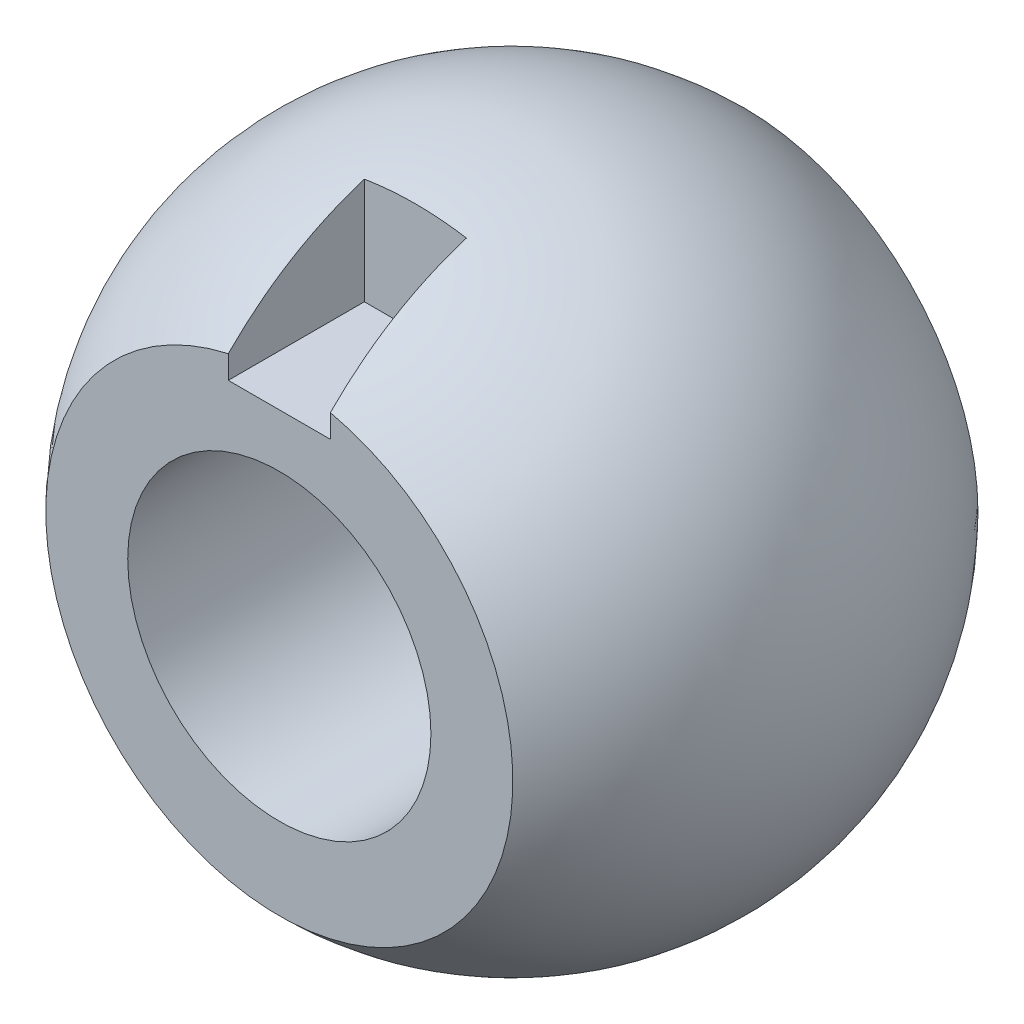
ISO-10303-21;
HEADER;
FILE_DESCRIPTION(('STEP AP214'),'2;1');
FILE_NAME('part.step','',(''),(''),'','','');
FILE_SCHEMA(('AUTOMOTIVE_DESIGN { 1 0 10303 214 1 1 1 1 }'));
ENDSEC;
DATA;
#1=APPLICATION_CONTEXT('core data for automotive mechanical design processes');
#2=APPLICATION_PROTOCOL_DEFINITION('international standard','automotive_design',2000,#1);
#3=PRODUCT_CONTEXT('',#1,'mechanical');
#4=PRODUCT('Part','Part','',(#3));
#5=PRODUCT_RELATED_PRODUCT_CATEGORY('part','',(#4));
#6=PRODUCT_DEFINITION_FORMATION('','',#4);
#7=PRODUCT_DEFINITION_CONTEXT('part definition',#1,'design');
#8=PRODUCT_DEFINITION('design','',#6,#7);
#9=PRODUCT_DEFINITION_SHAPE('','',#8);
#10=(LENGTH_UNIT() NAMED_UNIT(*) SI_UNIT(.MILLI.,.METRE.));
#11=(NAMED_UNIT(*) PLANE_ANGLE_UNIT() SI_UNIT($,.RADIAN.));
#12=(NAMED_UNIT(*) SI_UNIT($,.STERADIAN.) SOLID_ANGLE_UNIT());
#13=UNCERTAINTY_MEASURE_WITH_UNIT(LENGTH_MEASURE(1.E-05),#10,'distance_accuracy_value','');
#14=(GEOMETRIC_REPRESENTATION_CONTEXT(3) GLOBAL_UNCERTAINTY_ASSIGNED_CONTEXT((#13)) GLOBAL_UNIT_ASSIGNED_CONTEXT((#10,
#11,#12)) REPRESENTATION_CONTEXT('',''));
#15=CARTESIAN_POINT('',(0.,0.,0.));
#16=DIRECTION('',(0.,0.,1.));
#17=DIRECTION('',(1.,0.,0.));
#18=AXIS2_PLACEMENT_3D('',#15,#16,#17);
#19=CARTESIAN_POINT('',(0.,0.,0.));
#20=DIRECTION('',(0.,1.,0.));
#21=DIRECTION('',(1.,0.,0.));
#22=AXIS2_PLACEMENT_3D('',#19,#20,#21);
#23=SPHERICAL_SURFACE('',#22,7.874);
#24=CARTESIAN_POINT('',(-1.2192,0.,0.));
#25=DIRECTION('',(-1.,0.,0.));
#26=DIRECTION('',(0.,0.,1.));
#27=AXIS2_PLACEMENT_3D('',#24,#25,#26);
#28=CIRCLE('',#27,7.77903768855763);
#29=CARTESIAN_POINT('',(-1.2192,7.42968181401465,2.30505));
#30=VERTEX_POINT('',#29);
#31=CARTESIAN_POINT('',(-1.2192,5.44440201468444,5.55625));
#32=VERTEX_POINT('',#31);
#33=EDGE_CURVE('E97',#30,#32,#28,.F.);
#34=ORIENTED_EDGE('',*,*,#33,.F.);
#35=CARTESIAN_POINT('',(0.,0.,2.30505));
#36=DIRECTION('',(0.,0.,-1.));
#37=DIRECTION('',(-1.,0.,0.));
#38=AXIS2_PLACEMENT_3D('',#35,#36,#37);
#39=CIRCLE('',#38,7.52905176615887);
#40=CARTESIAN_POINT('',(1.2192,7.42968181401465,2.30505));
#41=VERTEX_POINT('',#40);
#42=EDGE_CURVE('E11',#41,#30,#39,.F.);
#43=ORIENTED_EDGE('',*,*,#42,.F.);
#44=CARTESIAN_POINT('',(1.2192,0.,0.));
#45=DIRECTION('',(1.,0.,0.));
#46=DIRECTION('',(0.,0.,-1.));
#47=AXIS2_PLACEMENT_3D('',#44,#45,#46);
#48=CIRCLE('',#47,7.77903768855763);
#49=CARTESIAN_POINT('',(1.2192,5.44440201468444,5.55625));
#50=VERTEX_POINT('',#49);
#51=EDGE_CURVE('E89',#50,#41,#48,.F.);
#52=ORIENTED_EDGE('',*,*,#51,.F.);
#53=CARTESIAN_POINT('',(0.,0.,5.55625));
#54=DIRECTION('',(0.,0.,1.));
#55=DIRECTION('',(1.,0.,0.));
#56=AXIS2_PLACEMENT_3D('',#53,#54,#55);
#57=CIRCLE('',#56,5.57924384997645);
#58=EDGE_CURVE('E104',#50,#32,#57,.F.);
#59=ORIENTED_EDGE('',*,*,#58,.T.);
#60=EDGE_LOOP('',(#34,#43,#52,#59));
#61=FACE_BOUND('',#60,.T.);
#62=CARTESIAN_POINT('',(0.,0.,-5.55625));
#63=DIRECTION('',(0.,0.,1.));
#64=DIRECTION('',(1.,0.,0.));
#65=AXIS2_PLACEMENT_3D('',#62,#63,#64);
#66=CIRCLE('',#65,5.57924384997645);
#67=CARTESIAN_POINT('',(5.57924384997645,0.,-5.55625));
#68=VERTEX_POINT('',#67);
#69=EDGE_CURVE('E100',#68,#68,#66,.F.);
#70=ORIENTED_EDGE('',*,*,#69,.F.);
#71=EDGE_LOOP('',(#70));
#72=FACE_BOUND('',#71,.T.);
#73=ADVANCED_FACE('F34',(#61,#72),#23,.T.);
#74=CARTESIAN_POINT('',(0.,0.,7.874));
#75=DIRECTION('',(0.,0.,-1.));
#76=DIRECTION('',(-1.,0.,0.));
#77=AXIS2_PLACEMENT_3D('',#74,#75,#76);
#78=CYLINDRICAL_SURFACE('',#77,3.62204);
#79=CARTESIAN_POINT('',(0.,0.,-5.55625));
#80=DIRECTION('',(0.,0.,1.));
#81=DIRECTION('',(1.,0.,0.));
#82=AXIS2_PLACEMENT_3D('',#79,#80,#81);
#83=CIRCLE('',#82,3.62204);
#84=CARTESIAN_POINT('',(3.62204,0.,-5.55625));
#85=VERTEX_POINT('',#84);
#86=EDGE_CURVE('E99',#85,#85,#83,.T.);
#87=ORIENTED_EDGE('',*,*,#86,.F.);
#88=EDGE_LOOP('',(#87));
#89=FACE_BOUND('',#88,.T.);
#90=CARTESIAN_POINT('',(0.,0.,5.55625));
#91=DIRECTION('',(0.,0.,1.));
#92=DIRECTION('',(1.,0.,0.));
#93=AXIS2_PLACEMENT_3D('',#90,#91,#92);
#94=CIRCLE('',#93,3.62204);
#95=CARTESIAN_POINT('',(3.62204,0.,5.55625));
#96=VERTEX_POINT('',#95);
#97=EDGE_CURVE('E103',#96,#96,#94,.T.);
#98=ORIENTED_EDGE('',*,*,#97,.T.);
#99=EDGE_LOOP('',(#98));
#100=FACE_BOUND('',#99,.T.);
#101=ADVANCED_FACE('F121',(#89,#100),#78,.F.);
#102=CARTESIAN_POINT('',(0.,0.,5.55625));
#103=DIRECTION('',(0.,0.,1.));
#104=DIRECTION('',(1.,0.,0.));
#105=AXIS2_PLACEMENT_3D('',#102,#103,#104);
#106=PLANE('',#105);
#107=DIRECTION('',(0.,-1.,0.));
#108=VECTOR('',#107,1.);
#109=CARTESIAN_POINT('',(-1.2192,0.,5.55625));
#110=LINE('',#109,#108);
#111=CARTESIAN_POINT('',(-1.2192,4.89204,5.55625));
#112=VERTEX_POINT('',#111);
#113=EDGE_CURVE('E41',#32,#112,#110,.T.);
#114=ORIENTED_EDGE('',*,*,#113,.F.);
#115=ORIENTED_EDGE('',*,*,#58,.F.);
#116=DIRECTION('',(0.,1.,0.));
#117=VECTOR('',#116,1.);
#118=CARTESIAN_POINT('',(1.2192,4.89204,5.55625));
#119=LINE('',#118,#117);
#120=CARTESIAN_POINT('',(1.2192,4.89204,5.55625));
#121=VERTEX_POINT('',#120);
#122=EDGE_CURVE('E78',#121,#50,#119,.T.);
#123=ORIENTED_EDGE('',*,*,#122,.F.);
#124=DIRECTION('',(1.,0.,0.));
#125=VECTOR('',#124,1.);
#126=CARTESIAN_POINT('',(0.,4.89204,5.55625));
#127=LINE('',#126,#125);
#128=EDGE_CURVE('E83',#112,#121,#127,.T.);
#129=ORIENTED_EDGE('',*,*,#128,.F.);
#130=EDGE_LOOP('',(#114,#115,#123,#129));
#131=FACE_BOUND('',#130,.T.);
#132=ORIENTED_EDGE('',*,*,#97,.F.);
#133=EDGE_LOOP('',(#132));
#134=FACE_BOUND('',#133,.T.);
#135=ADVANCED_FACE('F116',(#131,#134),#106,.T.);
#136=CARTESIAN_POINT('',(0.,0.,-5.55625));
#137=DIRECTION('',(0.,0.,1.));
#138=DIRECTION('',(1.,0.,0.));
#139=AXIS2_PLACEMENT_3D('',#136,#137,#138);
#140=PLANE('',#139);
#141=ORIENTED_EDGE('',*,*,#69,.T.);
#142=EDGE_LOOP('',(#141));
#143=FACE_BOUND('',#142,.T.);
#144=ORIENTED_EDGE('',*,*,#86,.T.);
#145=EDGE_LOOP('',(#144));
#146=FACE_BOUND('',#145,.T.);
#147=ADVANCED_FACE('F124',(#143,#146),#140,.F.);
#148=CARTESIAN_POINT('',(-1.2192,4.89204,2.30505));
#149=DIRECTION('',(-1.,0.,0.));
#150=DIRECTION('',(0.,0.,1.));
#151=AXIS2_PLACEMENT_3D('',#148,#149,#150);
#152=PLANE('',#151);
#153=ORIENTED_EDGE('',*,*,#33,.T.);
#154=ORIENTED_EDGE('',*,*,#113,.T.);
#155=DIRECTION('',(0.,0.,1.));
#156=VECTOR('',#155,1.);
#157=CARTESIAN_POINT('',(-1.2192,4.89204,2.30505));
#158=LINE('',#157,#156);
#159=CARTESIAN_POINT('',(-1.2192,4.89204,2.30505));
#160=VERTEX_POINT('',#159);
#161=EDGE_CURVE('E48',#160,#112,#158,.T.);
#162=ORIENTED_EDGE('',*,*,#161,.F.);
#163=DIRECTION('',(0.,-1.,0.));
#164=VECTOR('',#163,1.);
#165=CARTESIAN_POINT('',(-1.2192,4.89204,2.30505));
#166=LINE('',#165,#164);
#167=EDGE_CURVE('E77',#30,#160,#166,.T.);
#168=ORIENTED_EDGE('',*,*,#167,.F.);
#169=EDGE_LOOP('',(#153,#154,#162,#168));
#170=FACE_BOUND('',#169,.T.);
#171=ADVANCED_FACE('F112',(#170),#152,.F.);
#172=CARTESIAN_POINT('',(1.2192,4.89204,2.30505));
#173=DIRECTION('',(1.,0.,0.));
#174=DIRECTION('',(0.,0.,-1.));
#175=AXIS2_PLACEMENT_3D('',#172,#173,#174);
#176=PLANE('',#175);
#177=ORIENTED_EDGE('',*,*,#51,.T.);
#178=DIRECTION('',(0.,1.,0.));
#179=VECTOR('',#178,1.);
#180=CARTESIAN_POINT('',(1.2192,4.89204,2.30505));
#181=LINE('',#180,#179);
#182=CARTESIAN_POINT('',(1.2192,4.89204,2.30505));
#183=VERTEX_POINT('',#182);
#184=EDGE_CURVE('E76',#183,#41,#181,.T.);
#185=ORIENTED_EDGE('',*,*,#184,.F.);
#186=DIRECTION('',(0.,0.,1.));
#187=VECTOR('',#186,1.);
#188=CARTESIAN_POINT('',(1.2192,4.89204,2.30505));
#189=LINE('',#188,#187);
#190=EDGE_CURVE('E80',#183,#121,#189,.T.);
#191=ORIENTED_EDGE('',*,*,#190,.T.);
#192=ORIENTED_EDGE('',*,*,#122,.T.);
#193=EDGE_LOOP('',(#177,#185,#191,#192));
#194=FACE_BOUND('',#193,.T.);
#195=ADVANCED_FACE('F87',(#194),#176,.F.);
#196=CARTESIAN_POINT('',(0.,4.89204,2.30505));
#197=DIRECTION('',(0.,-1.,0.));
#198=DIRECTION('',(0.,0.,-1.));
#199=AXIS2_PLACEMENT_3D('',#196,#197,#198);
#200=PLANE('',#199);
#201=ORIENTED_EDGE('',*,*,#128,.T.);
#202=ORIENTED_EDGE('',*,*,#190,.F.);
#203=DIRECTION('',(1.,0.,0.));
#204=VECTOR('',#203,1.);
#205=CARTESIAN_POINT('',(0.,4.89204,2.30505));
#206=LINE('',#205,#204);
#207=EDGE_CURVE('E72',#160,#183,#206,.T.);
#208=ORIENTED_EDGE('',*,*,#207,.F.);
#209=ORIENTED_EDGE('',*,*,#161,.T.);
#210=EDGE_LOOP('',(#201,#202,#208,#209));
#211=FACE_BOUND('',#210,.T.);
#212=ADVANCED_FACE('F81',(#211),#200,.F.);
#213=CARTESIAN_POINT('',(0.,0.,2.30505));
#214=DIRECTION('',(0.,0.,-1.));
#215=DIRECTION('',(-1.,0.,0.));
#216=AXIS2_PLACEMENT_3D('',#213,#214,#215);
#217=PLANE('',#216);
#218=ORIENTED_EDGE('',*,*,#42,.T.);
#219=ORIENTED_EDGE('',*,*,#167,.T.);
#220=ORIENTED_EDGE('',*,*,#207,.T.);
#221=ORIENTED_EDGE('',*,*,#184,.T.);
#222=EDGE_LOOP('',(#218,#219,#220,#221));
#223=FACE_BOUND('',#222,.T.);
#224=ADVANCED_FACE('F74',(#223),#217,.F.);
#225=CLOSED_SHELL('',(#73,#101,#135,#147,#171,#195,#212,#224));
#226=MANIFOLD_SOLID_BREP('B2',#225);
#227=ADVANCED_BREP_SHAPE_REPRESENTATION('',(#18,#226),#14);
#228=SHAPE_DEFINITION_REPRESENTATION(#9,#227);
ENDSEC;
END-ISO-10303-21;
